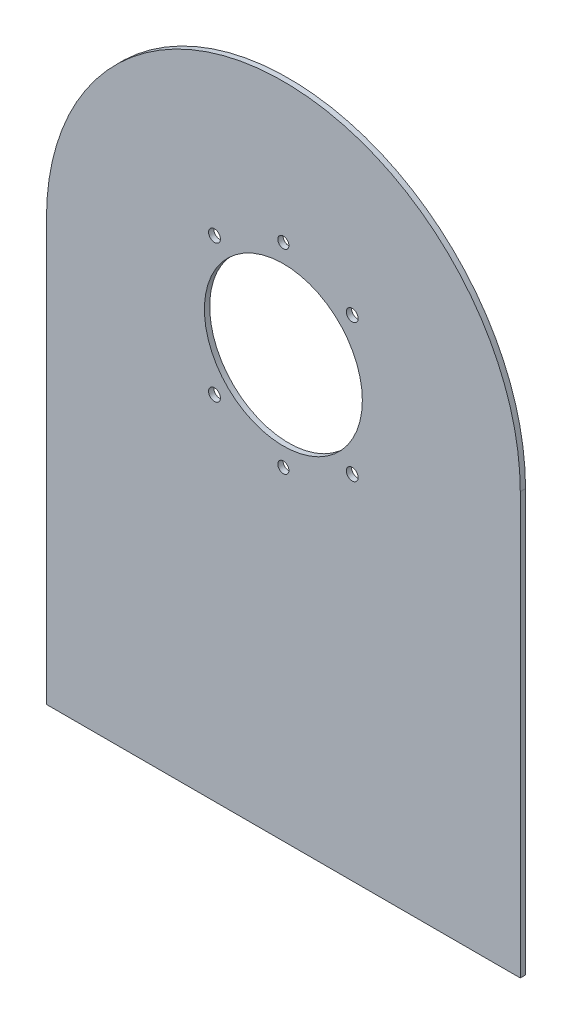
ISO-10303-21;
HEADER;
FILE_DESCRIPTION(('STEP AP214'),'2;1');
FILE_NAME('part.step','',(''),(''),'','','');
FILE_SCHEMA(('AUTOMOTIVE_DESIGN { 1 0 10303 214 1 1 1 1 }'));
ENDSEC;
DATA;
#1=APPLICATION_CONTEXT('core data for automotive mechanical design processes');
#2=APPLICATION_PROTOCOL_DEFINITION('international standard','automotive_design',2000,#1);
#3=PRODUCT_CONTEXT('',#1,'mechanical');
#4=PRODUCT('Part','Part','',(#3));
#5=PRODUCT_RELATED_PRODUCT_CATEGORY('part','',(#4));
#6=PRODUCT_DEFINITION_FORMATION('','',#4);
#7=PRODUCT_DEFINITION_CONTEXT('part definition',#1,'design');
#8=PRODUCT_DEFINITION('design','',#6,#7);
#9=PRODUCT_DEFINITION_SHAPE('','',#8);
#10=(LENGTH_UNIT() NAMED_UNIT(*) SI_UNIT(.MILLI.,.METRE.));
#11=(NAMED_UNIT(*) PLANE_ANGLE_UNIT() SI_UNIT($,.RADIAN.));
#12=(NAMED_UNIT(*) SI_UNIT($,.STERADIAN.) SOLID_ANGLE_UNIT());
#13=UNCERTAINTY_MEASURE_WITH_UNIT(LENGTH_MEASURE(1.E-05),#10,'distance_accuracy_value','');
#14=(GEOMETRIC_REPRESENTATION_CONTEXT(3) GLOBAL_UNCERTAINTY_ASSIGNED_CONTEXT((#13)) GLOBAL_UNIT_ASSIGNED_CONTEXT((#10,
#11,#12)) REPRESENTATION_CONTEXT('',''));
#15=CARTESIAN_POINT('',(0.,0.,0.));
#16=DIRECTION('',(0.,0.,1.));
#17=DIRECTION('',(1.,0.,0.));
#18=AXIS2_PLACEMENT_3D('',#15,#16,#17);
#19=CARTESIAN_POINT('',(0.,0.,0.));
#20=DIRECTION('',(0.,0.,1.));
#21=DIRECTION('',(1.,0.,0.));
#22=AXIS2_PLACEMENT_3D('',#19,#20,#21);
#23=PLANE('',#22);
#24=CARTESIAN_POINT('',(20.,-100.,0.));
#25=DIRECTION('',(0.,0.,1.));
#26=DIRECTION('',(1.,0.,0.));
#27=AXIS2_PLACEMENT_3D('',#24,#25,#26);
#28=CIRCLE('',#27,2.);
#29=CARTESIAN_POINT('',(22.,-100.,0.));
#30=VERTEX_POINT('',#29);
#31=EDGE_CURVE('E43',#30,#30,#28,.F.);
#32=ORIENTED_EDGE('',*,*,#31,.F.);
#33=EDGE_LOOP('',(#32));
#34=FACE_BOUND('',#33,.T.);
#35=CARTESIAN_POINT('',(0.,-37.,0.));
#36=DIRECTION('',(0.,0.,1.));
#37=DIRECTION('',(1.,0.,0.));
#38=AXIS2_PLACEMENT_3D('',#35,#36,#37);
#39=CIRCLE('',#38,2.1);
#40=CARTESIAN_POINT('',(2.1,-37.,0.));
#41=VERTEX_POINT('',#40);
#42=EDGE_CURVE('E123',#41,#41,#39,.F.);
#43=ORIENTED_EDGE('',*,*,#42,.F.);
#44=EDGE_LOOP('',(#43));
#45=FACE_BOUND('',#44,.T.);
#46=CARTESIAN_POINT('',(0.,37.,0.));
#47=DIRECTION('',(0.,0.,1.));
#48=DIRECTION('',(1.,0.,0.));
#49=AXIS2_PLACEMENT_3D('',#46,#47,#48);
#50=CIRCLE('',#49,2.1);
#51=CARTESIAN_POINT('',(2.1,37.,0.));
#52=VERTEX_POINT('',#51);
#53=EDGE_CURVE('E127',#52,#52,#50,.F.);
#54=ORIENTED_EDGE('',*,*,#53,.F.);
#55=EDGE_LOOP('',(#54));
#56=FACE_BOUND('',#55,.T.);
#57=CARTESIAN_POINT('',(26.1629509039022,-26.1629509039023,0.));
#58=DIRECTION('',(0.,0.,1.));
#59=DIRECTION('',(1.,0.,0.));
#60=AXIS2_PLACEMENT_3D('',#57,#58,#59);
#61=CIRCLE('',#60,2.25);
#62=CARTESIAN_POINT('',(28.4129509039022,-26.1629509039023,0.));
#63=VERTEX_POINT('',#62);
#64=EDGE_CURVE('E131',#63,#63,#61,.F.);
#65=ORIENTED_EDGE('',*,*,#64,.F.);
#66=EDGE_LOOP('',(#65));
#67=FACE_BOUND('',#66,.T.);
#68=CARTESIAN_POINT('',(-26.1629509039022,26.1629509039023,0.));
#69=DIRECTION('',(0.,0.,1.));
#70=DIRECTION('',(1.,0.,0.));
#71=AXIS2_PLACEMENT_3D('',#68,#69,#70);
#72=CIRCLE('',#71,2.25);
#73=CARTESIAN_POINT('',(-23.9129509039022,26.1629509039023,0.));
#74=VERTEX_POINT('',#73);
#75=EDGE_CURVE('E135',#74,#74,#72,.F.);
#76=ORIENTED_EDGE('',*,*,#75,.F.);
#77=EDGE_LOOP('',(#76));
#78=FACE_BOUND('',#77,.T.);
#79=CARTESIAN_POINT('',(-26.1629509039024,-26.1629509039021,0.));
#80=DIRECTION('',(0.,0.,1.));
#81=DIRECTION('',(1.,0.,0.));
#82=AXIS2_PLACEMENT_3D('',#79,#80,#81);
#83=CIRCLE('',#82,2.25);
#84=CARTESIAN_POINT('',(-23.9129509039024,-26.1629509039021,0.));
#85=VERTEX_POINT('',#84);
#86=EDGE_CURVE('E139',#85,#85,#83,.F.);
#87=ORIENTED_EDGE('',*,*,#86,.F.);
#88=EDGE_LOOP('',(#87));
#89=FACE_BOUND('',#88,.T.);
#90=CARTESIAN_POINT('',(26.1629509039024,26.1629509039021,0.));
#91=DIRECTION('',(0.,0.,1.));
#92=DIRECTION('',(1.,0.,0.));
#93=AXIS2_PLACEMENT_3D('',#90,#91,#92);
#94=CIRCLE('',#93,2.25);
#95=CARTESIAN_POINT('',(28.4129509039024,26.1629509039021,0.));
#96=VERTEX_POINT('',#95);
#97=EDGE_CURVE('E143',#96,#96,#94,.F.);
#98=ORIENTED_EDGE('',*,*,#97,.F.);
#99=EDGE_LOOP('',(#98));
#100=FACE_BOUND('',#99,.T.);
#101=DIRECTION('',(0.,1.,0.));
#102=VECTOR('',#101,1.);
#103=CARTESIAN_POINT('',(90.,0.,0.));
#104=LINE('',#103,#102);
#105=CARTESIAN_POINT('',(90.,-160.,0.));
#106=VERTEX_POINT('',#105);
#107=CARTESIAN_POINT('',(90.,0.,0.));
#108=VERTEX_POINT('',#107);
#109=EDGE_CURVE('E103',#106,#108,#104,.T.);
#110=ORIENTED_EDGE('',*,*,#109,.F.);
#111=DIRECTION('',(1.,0.,0.));
#112=VECTOR('',#111,1.);
#113=CARTESIAN_POINT('',(-90.,-160.,0.));
#114=LINE('',#113,#112);
#115=CARTESIAN_POINT('',(-90.,-160.,0.));
#116=VERTEX_POINT('',#115);
#117=EDGE_CURVE('E74',#116,#106,#114,.T.);
#118=ORIENTED_EDGE('',*,*,#117,.F.);
#119=DIRECTION('',(0.,-1.,0.));
#120=VECTOR('',#119,1.);
#121=CARTESIAN_POINT('',(-90.,0.,0.));
#122=LINE('',#121,#120);
#123=CARTESIAN_POINT('',(-90.,0.,0.));
#124=VERTEX_POINT('',#123);
#125=EDGE_CURVE('E68',#124,#116,#122,.T.);
#126=ORIENTED_EDGE('',*,*,#125,.F.);
#127=CARTESIAN_POINT('',(0.,0.,0.));
#128=DIRECTION('',(0.,0.,1.));
#129=DIRECTION('',(1.,0.,0.));
#130=AXIS2_PLACEMENT_3D('',#127,#128,#129);
#131=CIRCLE('',#130,90.);
#132=EDGE_CURVE('E93',#108,#124,#131,.T.);
#133=ORIENTED_EDGE('',*,*,#132,.F.);
#134=EDGE_LOOP('',(#110,#118,#126,#133));
#135=FACE_BOUND('',#134,.T.);
#136=CARTESIAN_POINT('',(0.,0.,0.));
#137=DIRECTION('',(0.,0.,1.));
#138=DIRECTION('',(1.,0.,0.));
#139=AXIS2_PLACEMENT_3D('',#136,#137,#138);
#140=CIRCLE('',#139,30.);
#141=CARTESIAN_POINT('',(30.,0.,0.));
#142=VERTEX_POINT('',#141);
#143=EDGE_CURVE('E149',#142,#142,#140,.T.);
#144=ORIENTED_EDGE('',*,*,#143,.T.);
#145=EDGE_LOOP('',(#144));
#146=FACE_BOUND('',#145,.T.);
#147=CARTESIAN_POINT('',(-20.,-100.,0.));
#148=DIRECTION('',(0.,0.,1.));
#149=DIRECTION('',(1.,0.,0.));
#150=AXIS2_PLACEMENT_3D('',#147,#148,#149);
#151=CIRCLE('',#150,2.);
#152=CARTESIAN_POINT('',(-18.,-100.,0.));
#153=VERTEX_POINT('',#152);
#154=EDGE_CURVE('E11',#153,#153,#151,.F.);
#155=ORIENTED_EDGE('',*,*,#154,.F.);
#156=EDGE_LOOP('',(#155));
#157=FACE_BOUND('',#156,.T.);
#158=ADVANCED_FACE('F34',(#34,#45,#56,#67,#78,#89,#100,#135,#146,#157),#23,.F.);
#159=CARTESIAN_POINT('',(0.,0.,2.));
#160=DIRECTION('',(0.,0.,1.));
#161=DIRECTION('',(1.,0.,0.));
#162=AXIS2_PLACEMENT_3D('',#159,#160,#161);
#163=PLANE('',#162);
#164=CARTESIAN_POINT('',(0.,-37.,2.));
#165=DIRECTION('',(0.,0.,1.));
#166=DIRECTION('',(1.,0.,0.));
#167=AXIS2_PLACEMENT_3D('',#164,#165,#166);
#168=CIRCLE('',#167,2.1);
#169=CARTESIAN_POINT('',(2.1,-37.,2.));
#170=VERTEX_POINT('',#169);
#171=EDGE_CURVE('E238',#170,#170,#168,.T.);
#172=ORIENTED_EDGE('',*,*,#171,.F.);
#173=EDGE_LOOP('',(#172));
#174=FACE_BOUND('',#173,.T.);
#175=CARTESIAN_POINT('',(0.,37.,2.));
#176=DIRECTION('',(0.,0.,1.));
#177=DIRECTION('',(1.,0.,0.));
#178=AXIS2_PLACEMENT_3D('',#175,#176,#177);
#179=CIRCLE('',#178,2.1);
#180=CARTESIAN_POINT('',(2.1,37.,2.));
#181=VERTEX_POINT('',#180);
#182=EDGE_CURVE('E234',#181,#181,#179,.T.);
#183=ORIENTED_EDGE('',*,*,#182,.F.);
#184=EDGE_LOOP('',(#183));
#185=FACE_BOUND('',#184,.T.);
#186=CARTESIAN_POINT('',(26.1629509039022,-26.1629509039023,2.));
#187=DIRECTION('',(0.,0.,1.));
#188=DIRECTION('',(1.,0.,0.));
#189=AXIS2_PLACEMENT_3D('',#186,#187,#188);
#190=CIRCLE('',#189,2.25);
#191=CARTESIAN_POINT('',(28.4129509039022,-26.1629509039023,2.));
#192=VERTEX_POINT('',#191);
#193=EDGE_CURVE('E230',#192,#192,#190,.T.);
#194=ORIENTED_EDGE('',*,*,#193,.F.);
#195=EDGE_LOOP('',(#194));
#196=FACE_BOUND('',#195,.T.);
#197=CARTESIAN_POINT('',(-26.1629509039022,26.1629509039023,2.));
#198=DIRECTION('',(0.,0.,1.));
#199=DIRECTION('',(1.,0.,0.));
#200=AXIS2_PLACEMENT_3D('',#197,#198,#199);
#201=CIRCLE('',#200,2.25);
#202=CARTESIAN_POINT('',(-23.9129509039022,26.1629509039023,2.));
#203=VERTEX_POINT('',#202);
#204=EDGE_CURVE('E226',#203,#203,#201,.T.);
#205=ORIENTED_EDGE('',*,*,#204,.F.);
#206=EDGE_LOOP('',(#205));
#207=FACE_BOUND('',#206,.T.);
#208=CARTESIAN_POINT('',(-26.1629509039024,-26.1629509039021,2.));
#209=DIRECTION('',(0.,0.,1.));
#210=DIRECTION('',(1.,0.,0.));
#211=AXIS2_PLACEMENT_3D('',#208,#209,#210);
#212=CIRCLE('',#211,2.25);
#213=CARTESIAN_POINT('',(-23.9129509039024,-26.1629509039021,2.));
#214=VERTEX_POINT('',#213);
#215=EDGE_CURVE('E222',#214,#214,#212,.T.);
#216=ORIENTED_EDGE('',*,*,#215,.F.);
#217=EDGE_LOOP('',(#216));
#218=FACE_BOUND('',#217,.T.);
#219=CARTESIAN_POINT('',(26.1629509039024,26.1629509039021,2.));
#220=DIRECTION('',(0.,0.,1.));
#221=DIRECTION('',(1.,0.,0.));
#222=AXIS2_PLACEMENT_3D('',#219,#220,#221);
#223=CIRCLE('',#222,2.25);
#224=CARTESIAN_POINT('',(28.4129509039024,26.1629509039021,2.));
#225=VERTEX_POINT('',#224);
#226=EDGE_CURVE('E218',#225,#225,#223,.T.);
#227=ORIENTED_EDGE('',*,*,#226,.F.);
#228=EDGE_LOOP('',(#227));
#229=FACE_BOUND('',#228,.T.);
#230=DIRECTION('',(0.,1.,0.));
#231=VECTOR('',#230,1.);
#232=CARTESIAN_POINT('',(90.,0.,2.));
#233=LINE('',#232,#231);
#234=CARTESIAN_POINT('',(90.,-160.,2.));
#235=VERTEX_POINT('',#234);
#236=CARTESIAN_POINT('',(90.,0.,2.));
#237=VERTEX_POINT('',#236);
#238=EDGE_CURVE('E88',#235,#237,#233,.T.);
#239=ORIENTED_EDGE('',*,*,#238,.T.);
#240=CARTESIAN_POINT('',(0.,0.,2.));
#241=DIRECTION('',(0.,0.,1.));
#242=DIRECTION('',(1.,0.,0.));
#243=AXIS2_PLACEMENT_3D('',#240,#241,#242);
#244=CIRCLE('',#243,90.);
#245=CARTESIAN_POINT('',(-90.,0.,2.));
#246=VERTEX_POINT('',#245);
#247=EDGE_CURVE('E82',#237,#246,#244,.T.);
#248=ORIENTED_EDGE('',*,*,#247,.T.);
#249=DIRECTION('',(0.,-1.,0.));
#250=VECTOR('',#249,1.);
#251=CARTESIAN_POINT('',(-90.,0.,2.));
#252=LINE('',#251,#250);
#253=CARTESIAN_POINT('',(-90.,-160.,2.));
#254=VERTEX_POINT('',#253);
#255=EDGE_CURVE('E86',#246,#254,#252,.T.);
#256=ORIENTED_EDGE('',*,*,#255,.T.);
#257=DIRECTION('',(1.,0.,0.));
#258=VECTOR('',#257,1.);
#259=CARTESIAN_POINT('',(-90.,-160.,2.));
#260=LINE('',#259,#258);
#261=EDGE_CURVE('E51',#254,#235,#260,.T.);
#262=ORIENTED_EDGE('',*,*,#261,.T.);
#263=EDGE_LOOP('',(#239,#248,#256,#262));
#264=FACE_BOUND('',#263,.T.);
#265=CARTESIAN_POINT('',(0.,0.,2.));
#266=DIRECTION('',(0.,0.,1.));
#267=DIRECTION('',(1.,0.,0.));
#268=AXIS2_PLACEMENT_3D('',#265,#266,#267);
#269=CIRCLE('',#268,30.);
#270=CARTESIAN_POINT('',(30.,0.,2.));
#271=VERTEX_POINT('',#270);
#272=EDGE_CURVE('E106',#271,#271,#269,.T.);
#273=ORIENTED_EDGE('',*,*,#272,.F.);
#274=EDGE_LOOP('',(#273));
#275=FACE_BOUND('',#274,.T.);
#276=ADVANCED_FACE('F83',(#174,#185,#196,#207,#218,#229,#264,#275),#163,.T.);
#277=CARTESIAN_POINT('',(90.,0.,2.));
#278=DIRECTION('',(-1.,0.,0.));
#279=DIRECTION('',(0.,-1.,0.));
#280=AXIS2_PLACEMENT_3D('',#277,#278,#279);
#281=PLANE('',#280);
#282=ORIENTED_EDGE('',*,*,#109,.T.);
#283=DIRECTION('',(0.,0.,-1.));
#284=VECTOR('',#283,1.);
#285=CARTESIAN_POINT('',(90.,0.,2.));
#286=LINE('',#285,#284);
#287=EDGE_CURVE('E94',#237,#108,#286,.T.);
#288=ORIENTED_EDGE('',*,*,#287,.F.);
#289=ORIENTED_EDGE('',*,*,#238,.F.);
#290=DIRECTION('',(0.,0.,-1.));
#291=VECTOR('',#290,1.);
#292=CARTESIAN_POINT('',(90.,-160.,2.));
#293=LINE('',#292,#291);
#294=EDGE_CURVE('E99',#235,#106,#293,.T.);
#295=ORIENTED_EDGE('',*,*,#294,.T.);
#296=EDGE_LOOP('',(#282,#288,#289,#295));
#297=FACE_BOUND('',#296,.T.);
#298=ADVANCED_FACE('F36',(#297),#281,.F.);
#299=CARTESIAN_POINT('',(0.,0.,2.));
#300=DIRECTION('',(0.,0.,-1.));
#301=DIRECTION('',(-1.,0.,0.));
#302=AXIS2_PLACEMENT_3D('',#299,#300,#301);
#303=CYLINDRICAL_SURFACE('',#302,90.);
#304=ORIENTED_EDGE('',*,*,#132,.T.);
#305=DIRECTION('',(0.,0.,-1.));
#306=VECTOR('',#305,1.);
#307=CARTESIAN_POINT('',(-90.,0.,2.));
#308=LINE('',#307,#306);
#309=EDGE_CURVE('E91',#246,#124,#308,.T.);
#310=ORIENTED_EDGE('',*,*,#309,.F.);
#311=ORIENTED_EDGE('',*,*,#247,.F.);
#312=ORIENTED_EDGE('',*,*,#287,.T.);
#313=EDGE_LOOP('',(#304,#310,#311,#312));
#314=FACE_BOUND('',#313,.T.);
#315=ADVANCED_FACE('F92',(#314),#303,.T.);
#316=CARTESIAN_POINT('',(-90.,0.,2.));
#317=DIRECTION('',(1.,0.,0.));
#318=DIRECTION('',(0.,1.,0.));
#319=AXIS2_PLACEMENT_3D('',#316,#317,#318);
#320=PLANE('',#319);
#321=ORIENTED_EDGE('',*,*,#125,.T.);
#322=DIRECTION('',(0.,0.,-1.));
#323=VECTOR('',#322,1.);
#324=CARTESIAN_POINT('',(-90.,-160.,2.));
#325=LINE('',#324,#323);
#326=EDGE_CURVE('E95',#254,#116,#325,.T.);
#327=ORIENTED_EDGE('',*,*,#326,.F.);
#328=ORIENTED_EDGE('',*,*,#255,.F.);
#329=ORIENTED_EDGE('',*,*,#309,.T.);
#330=EDGE_LOOP('',(#321,#327,#328,#329));
#331=FACE_BOUND('',#330,.T.);
#332=ADVANCED_FACE('F97',(#331),#320,.F.);
#333=CARTESIAN_POINT('',(-90.,-160.,2.));
#334=DIRECTION('',(0.,1.,0.));
#335=DIRECTION('',(0.,0.,1.));
#336=AXIS2_PLACEMENT_3D('',#333,#334,#335);
#337=PLANE('',#336);
#338=ORIENTED_EDGE('',*,*,#117,.T.);
#339=ORIENTED_EDGE('',*,*,#294,.F.);
#340=ORIENTED_EDGE('',*,*,#261,.F.);
#341=ORIENTED_EDGE('',*,*,#326,.T.);
#342=EDGE_LOOP('',(#338,#339,#340,#341));
#343=FACE_BOUND('',#342,.T.);
#344=ADVANCED_FACE('F198',(#343),#337,.F.);
#345=CARTESIAN_POINT('',(0.,0.,2.));
#346=DIRECTION('',(0.,0.,-1.));
#347=DIRECTION('',(-1.,0.,0.));
#348=AXIS2_PLACEMENT_3D('',#345,#346,#347);
#349=CYLINDRICAL_SURFACE('',#348,30.);
#350=ORIENTED_EDGE('',*,*,#272,.T.);
#351=EDGE_LOOP('',(#350));
#352=FACE_BOUND('',#351,.T.);
#353=ORIENTED_EDGE('',*,*,#143,.F.);
#354=EDGE_LOOP('',(#353));
#355=FACE_BOUND('',#354,.T.);
#356=ADVANCED_FACE('F194',(#352,#355),#349,.F.);
#357=CARTESIAN_POINT('',(26.1629509039024,26.1629509039021,-0.00100000000000013));
#358=DIRECTION('',(0.,0.,1.));
#359=DIRECTION('',(1.,0.,0.));
#360=AXIS2_PLACEMENT_3D('',#357,#358,#359);
#361=CYLINDRICAL_SURFACE('',#360,2.25);
#362=ORIENTED_EDGE('',*,*,#226,.T.);
#363=EDGE_LOOP('',(#362));
#364=FACE_BOUND('',#363,.T.);
#365=ORIENTED_EDGE('',*,*,#97,.T.);
#366=EDGE_LOOP('',(#365));
#367=FACE_BOUND('',#366,.T.);
#368=ADVANCED_FACE('F190',(#364,#367),#361,.F.);
#369=CARTESIAN_POINT('',(-26.1629509039024,-26.1629509039021,-0.00100000000000013));
#370=DIRECTION('',(0.,0.,1.));
#371=DIRECTION('',(1.,0.,0.));
#372=AXIS2_PLACEMENT_3D('',#369,#370,#371);
#373=CYLINDRICAL_SURFACE('',#372,2.25);
#374=ORIENTED_EDGE('',*,*,#215,.T.);
#375=EDGE_LOOP('',(#374));
#376=FACE_BOUND('',#375,.T.);
#377=ORIENTED_EDGE('',*,*,#86,.T.);
#378=EDGE_LOOP('',(#377));
#379=FACE_BOUND('',#378,.T.);
#380=ADVANCED_FACE('F186',(#376,#379),#373,.F.);
#381=CARTESIAN_POINT('',(-26.1629509039022,26.1629509039023,-0.00100000000000013));
#382=DIRECTION('',(0.,0.,1.));
#383=DIRECTION('',(1.,0.,0.));
#384=AXIS2_PLACEMENT_3D('',#381,#382,#383);
#385=CYLINDRICAL_SURFACE('',#384,2.25);
#386=ORIENTED_EDGE('',*,*,#204,.T.);
#387=EDGE_LOOP('',(#386));
#388=FACE_BOUND('',#387,.T.);
#389=ORIENTED_EDGE('',*,*,#75,.T.);
#390=EDGE_LOOP('',(#389));
#391=FACE_BOUND('',#390,.T.);
#392=ADVANCED_FACE('F182',(#388,#391),#385,.F.);
#393=CARTESIAN_POINT('',(26.1629509039022,-26.1629509039023,-0.00100000000000013));
#394=DIRECTION('',(0.,0.,1.));
#395=DIRECTION('',(1.,0.,0.));
#396=AXIS2_PLACEMENT_3D('',#393,#394,#395);
#397=CYLINDRICAL_SURFACE('',#396,2.25);
#398=ORIENTED_EDGE('',*,*,#193,.T.);
#399=EDGE_LOOP('',(#398));
#400=FACE_BOUND('',#399,.T.);
#401=ORIENTED_EDGE('',*,*,#64,.T.);
#402=EDGE_LOOP('',(#401));
#403=FACE_BOUND('',#402,.T.);
#404=ADVANCED_FACE('F178',(#400,#403),#397,.F.);
#405=CARTESIAN_POINT('',(0.,37.,-0.00100000000000013));
#406=DIRECTION('',(0.,0.,1.));
#407=DIRECTION('',(1.,0.,0.));
#408=AXIS2_PLACEMENT_3D('',#405,#406,#407);
#409=CYLINDRICAL_SURFACE('',#408,2.1);
#410=ORIENTED_EDGE('',*,*,#182,.T.);
#411=EDGE_LOOP('',(#410));
#412=FACE_BOUND('',#411,.T.);
#413=ORIENTED_EDGE('',*,*,#53,.T.);
#414=EDGE_LOOP('',(#413));
#415=FACE_BOUND('',#414,.T.);
#416=ADVANCED_FACE('F174',(#412,#415),#409,.F.);
#417=CARTESIAN_POINT('',(0.,-37.,-0.00100000000000013));
#418=DIRECTION('',(0.,0.,1.));
#419=DIRECTION('',(1.,0.,0.));
#420=AXIS2_PLACEMENT_3D('',#417,#418,#419);
#421=CYLINDRICAL_SURFACE('',#420,2.1);
#422=ORIENTED_EDGE('',*,*,#171,.T.);
#423=EDGE_LOOP('',(#422));
#424=FACE_BOUND('',#423,.T.);
#425=ORIENTED_EDGE('',*,*,#42,.T.);
#426=EDGE_LOOP('',(#425));
#427=FACE_BOUND('',#426,.T.);
#428=ADVANCED_FACE('F170',(#424,#427),#421,.F.);
#429=CARTESIAN_POINT('',(20.,-100.,-20.));
#430=DIRECTION('',(0.,0.,1.));
#431=DIRECTION('',(1.,0.,0.));
#432=AXIS2_PLACEMENT_3D('',#429,#430,#431);
#433=CYLINDRICAL_SURFACE('',#432,2.);
#434=CARTESIAN_POINT('',(20.,-100.,-20.));
#435=DIRECTION('',(0.,0.,-1.));
#436=DIRECTION('',(-1.,0.,0.));
#437=AXIS2_PLACEMENT_3D('',#434,#435,#436);
#438=CIRCLE('',#437,2.);
#439=CARTESIAN_POINT('',(18.,-100.,-20.));
#440=VERTEX_POINT('',#439);
#441=EDGE_CURVE('E241',#440,#440,#438,.T.);
#442=ORIENTED_EDGE('',*,*,#441,.F.);
#443=EDGE_LOOP('',(#442));
#444=FACE_BOUND('',#443,.T.);
#445=ORIENTED_EDGE('',*,*,#31,.T.);
#446=EDGE_LOOP('',(#445));
#447=FACE_BOUND('',#446,.T.);
#448=ADVANCED_FACE('F115',(#444,#447),#433,.T.);
#449=CARTESIAN_POINT('',(20.,-100.,-20.));
#450=DIRECTION('',(0.,0.,-1.));
#451=DIRECTION('',(-1.,0.,0.));
#452=AXIS2_PLACEMENT_3D('',#449,#450,#451);
#453=PLANE('',#452);
#454=ORIENTED_EDGE('',*,*,#441,.T.);
#455=EDGE_LOOP('',(#454));
#456=FACE_BOUND('',#455,.T.);
#457=ADVANCED_FACE('F155',(#456),#453,.T.);
#458=CARTESIAN_POINT('',(-20.,-100.,-20.));
#459=DIRECTION('',(0.,0.,1.));
#460=DIRECTION('',(1.,0.,0.));
#461=AXIS2_PLACEMENT_3D('',#458,#459,#460);
#462=CYLINDRICAL_SURFACE('',#461,2.);
#463=CARTESIAN_POINT('',(-20.,-100.,-20.));
#464=DIRECTION('',(0.,0.,-1.));
#465=DIRECTION('',(-1.,0.,0.));
#466=AXIS2_PLACEMENT_3D('',#463,#464,#465);
#467=CIRCLE('',#466,2.);
#468=CARTESIAN_POINT('',(-22.,-100.,-20.));
#469=VERTEX_POINT('',#468);
#470=EDGE_CURVE('E244',#469,#469,#467,.T.);
#471=ORIENTED_EDGE('',*,*,#470,.F.);
#472=EDGE_LOOP('',(#471));
#473=FACE_BOUND('',#472,.T.);
#474=ORIENTED_EDGE('',*,*,#154,.T.);
#475=EDGE_LOOP('',(#474));
#476=FACE_BOUND('',#475,.T.);
#477=ADVANCED_FACE('F152',(#473,#476),#462,.T.);
#478=CARTESIAN_POINT('',(-20.,-100.,-20.));
#479=DIRECTION('',(0.,0.,-1.));
#480=DIRECTION('',(-1.,0.,0.));
#481=AXIS2_PLACEMENT_3D('',#478,#479,#480);
#482=PLANE('',#481);
#483=ORIENTED_EDGE('',*,*,#470,.T.);
#484=EDGE_LOOP('',(#483));
#485=FACE_BOUND('',#484,.T.);
#486=ADVANCED_FACE('F154',(#485),#482,.T.);
#487=CLOSED_SHELL('',(#158,#276,#298,#315,#332,#344,#356,#368,#380,#392,#404,#416,#428,#448,
#457,#477,#486));
#488=MANIFOLD_SOLID_BREP('B2',#487);
#489=ADVANCED_BREP_SHAPE_REPRESENTATION('',(#18,#488),#14);
#490=SHAPE_DEFINITION_REPRESENTATION(#9,#489);
ENDSEC;
END-ISO-10303-21;
